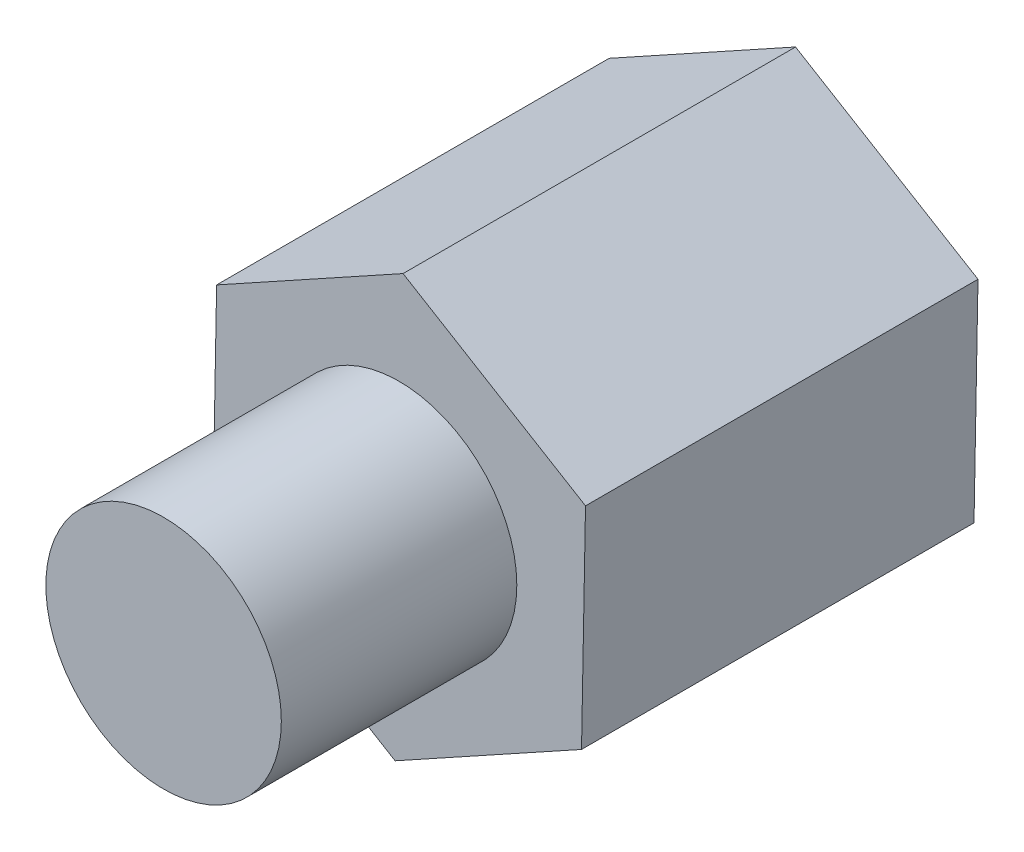
ISO-10303-21;
HEADER;
FILE_DESCRIPTION(('STEP AP214'),'2;1');
FILE_NAME('part.step','',(''),(''),'','','');
FILE_SCHEMA(('AUTOMOTIVE_DESIGN { 1 0 10303 214 1 1 1 1 }'));
ENDSEC;
DATA;
#1=APPLICATION_CONTEXT('core data for automotive mechanical design processes');
#2=APPLICATION_PROTOCOL_DEFINITION('international standard','automotive_design',2000,#1);
#3=PRODUCT_CONTEXT('',#1,'mechanical');
#4=PRODUCT('Part','Part','',(#3));
#5=PRODUCT_RELATED_PRODUCT_CATEGORY('part','',(#4));
#6=PRODUCT_DEFINITION_FORMATION('','',#4);
#7=PRODUCT_DEFINITION_CONTEXT('part definition',#1,'design');
#8=PRODUCT_DEFINITION('design','',#6,#7);
#9=PRODUCT_DEFINITION_SHAPE('','',#8);
#10=(LENGTH_UNIT() NAMED_UNIT(*) SI_UNIT(.MILLI.,.METRE.));
#11=(NAMED_UNIT(*) PLANE_ANGLE_UNIT() SI_UNIT($,.RADIAN.));
#12=(NAMED_UNIT(*) SI_UNIT($,.STERADIAN.) SOLID_ANGLE_UNIT());
#13=UNCERTAINTY_MEASURE_WITH_UNIT(LENGTH_MEASURE(1.E-05),#10,'distance_accuracy_value','');
#14=(GEOMETRIC_REPRESENTATION_CONTEXT(3) GLOBAL_UNCERTAINTY_ASSIGNED_CONTEXT((#13)) GLOBAL_UNIT_ASSIGNED_CONTEXT((#10,
#11,#12)) REPRESENTATION_CONTEXT('',''));
#15=CARTESIAN_POINT('',(0.,0.,0.));
#16=DIRECTION('',(0.,0.,1.));
#17=DIRECTION('',(1.,0.,0.));
#18=AXIS2_PLACEMENT_3D('',#15,#16,#17);
#19=CARTESIAN_POINT('',(0.0507511059576976,2.71307162798504,5.));
#20=DIRECTION('',(0.483715381528788,-0.875225359363209,0.));
#21=DIRECTION('',(0.875225359363209,0.483715381528788,0.));
#22=AXIS2_PLACEMENT_3D('',#19,#20,#21);
#23=PLANE('',#22);
#24=DIRECTION('',(-0.875225359363209,-0.483715381528788,0.));
#25=VECTOR('',#24,1.);
#26=CARTESIAN_POINT('',(0.0507511059576976,2.71307162798504,0.));
#27=LINE('',#26,#25);
#28=CARTESIAN_POINT('',(0.0507511059576976,2.71307162798504,0.));
#29=VERTEX_POINT('',#28);
#30=CARTESIAN_POINT('',(-2.324213399143,1.40048756102204,0.));
#31=VERTEX_POINT('',#30);
#32=EDGE_CURVE('E136',#29,#31,#27,.T.);
#33=ORIENTED_EDGE('',*,*,#32,.T.);
#34=DIRECTION('',(0.,0.,-1.));
#35=VECTOR('',#34,1.);
#36=CARTESIAN_POINT('',(-2.324213399143,1.40048756102204,5.));
#37=LINE('',#36,#35);
#38=CARTESIAN_POINT('',(-2.324213399143,1.40048756102204,5.));
#39=VERTEX_POINT('',#38);
#40=EDGE_CURVE('E48',#39,#31,#37,.T.);
#41=ORIENTED_EDGE('',*,*,#40,.F.);
#42=DIRECTION('',(-0.875225359363209,-0.483715381528788,0.));
#43=VECTOR('',#42,1.);
#44=CARTESIAN_POINT('',(0.0507511059576976,2.71307162798504,5.));
#45=LINE('',#44,#43);
#46=CARTESIAN_POINT('',(0.0507511059576976,2.71307162798504,5.));
#47=VERTEX_POINT('',#46);
#48=EDGE_CURVE('E153',#47,#39,#45,.T.);
#49=ORIENTED_EDGE('',*,*,#48,.F.);
#50=DIRECTION('',(0.,0.,-1.));
#51=VECTOR('',#50,1.);
#52=CARTESIAN_POINT('',(0.0507511059576976,2.71307162798504,5.));
#53=LINE('',#52,#51);
#54=EDGE_CURVE('E132',#47,#29,#53,.T.);
#55=ORIENTED_EDGE('',*,*,#54,.T.);
#56=EDGE_LOOP('',(#33,#41,#49,#55));
#57=FACE_BOUND('',#56,.T.);
#58=ADVANCED_FACE('F45',(#57),#23,.F.);
#59=CARTESIAN_POINT('',(-2.324213399143,1.40048756102204,5.));
#60=DIRECTION('',(0.999825086009298,-0.0187028710763916,0.));
#61=DIRECTION('',(0.0187028710763916,0.999825086009298,0.));
#62=AXIS2_PLACEMENT_3D('',#59,#60,#61);
#63=PLANE('',#62);
#64=DIRECTION('',(-0.0187028710763916,-0.999825086009298,0.));
#65=VECTOR('',#64,1.);
#66=CARTESIAN_POINT('',(-2.324213399143,1.40048756102204,0.));
#67=LINE('',#66,#65);
#68=CARTESIAN_POINT('',(-2.3749645051007,-1.312584066963,0.));
#69=VERTEX_POINT('',#68);
#70=EDGE_CURVE('E140',#31,#69,#67,.T.);
#71=ORIENTED_EDGE('',*,*,#70,.T.);
#72=DIRECTION('',(0.,0.,-1.));
#73=VECTOR('',#72,1.);
#74=CARTESIAN_POINT('',(-2.3749645051007,-1.312584066963,5.));
#75=LINE('',#74,#73);
#76=CARTESIAN_POINT('',(-2.3749645051007,-1.312584066963,5.));
#77=VERTEX_POINT('',#76);
#78=EDGE_CURVE('E159',#77,#69,#75,.T.);
#79=ORIENTED_EDGE('',*,*,#78,.F.);
#80=DIRECTION('',(-0.0187028710763916,-0.999825086009298,0.));
#81=VECTOR('',#80,1.);
#82=CARTESIAN_POINT('',(-2.324213399143,1.40048756102204,5.));
#83=LINE('',#82,#81);
#84=EDGE_CURVE('E101',#39,#77,#83,.T.);
#85=ORIENTED_EDGE('',*,*,#84,.F.);
#86=ORIENTED_EDGE('',*,*,#40,.T.);
#87=EDGE_LOOP('',(#71,#79,#85,#86));
#88=FACE_BOUND('',#87,.T.);
#89=ADVANCED_FACE('F166',(#88),#63,.F.);
#90=CARTESIAN_POINT('',(-2.3749645051007,-1.312584066963,5.));
#91=DIRECTION('',(0.51610970448051,0.856522488286817,0.));
#92=DIRECTION('',(-0.856522488286817,0.51610970448051,0.));
#93=AXIS2_PLACEMENT_3D('',#90,#91,#92);
#94=PLANE('',#93);
#95=DIRECTION('',(0.856522488286817,-0.51610970448051,0.));
#96=VECTOR('',#95,1.);
#97=CARTESIAN_POINT('',(-2.3749645051007,-1.312584066963,0.));
#98=LINE('',#97,#96);
#99=CARTESIAN_POINT('',(-0.0507511059576958,-2.71307162798504,0.));
#100=VERTEX_POINT('',#99);
#101=EDGE_CURVE('E144',#69,#100,#98,.T.);
#102=ORIENTED_EDGE('',*,*,#101,.T.);
#103=DIRECTION('',(0.,0.,-1.));
#104=VECTOR('',#103,1.);
#105=CARTESIAN_POINT('',(-0.0507511059576958,-2.71307162798504,5.));
#106=LINE('',#105,#104);
#107=CARTESIAN_POINT('',(-0.0507511059576958,-2.71307162798504,5.));
#108=VERTEX_POINT('',#107);
#109=EDGE_CURVE('E125',#108,#100,#106,.T.);
#110=ORIENTED_EDGE('',*,*,#109,.F.);
#111=DIRECTION('',(0.856522488286817,-0.51610970448051,0.));
#112=VECTOR('',#111,1.);
#113=CARTESIAN_POINT('',(-2.3749645051007,-1.312584066963,5.));
#114=LINE('',#113,#112);
#115=EDGE_CURVE('E114',#77,#108,#114,.T.);
#116=ORIENTED_EDGE('',*,*,#115,.F.);
#117=ORIENTED_EDGE('',*,*,#78,.T.);
#118=EDGE_LOOP('',(#102,#110,#116,#117));
#119=FACE_BOUND('',#118,.T.);
#120=ADVANCED_FACE('F172',(#119),#94,.F.);
#121=CARTESIAN_POINT('',(-0.0507511059576958,-2.71307162798504,5.));
#122=DIRECTION('',(-0.483715381528788,0.875225359363209,0.));
#123=DIRECTION('',(-0.87522535936321,-0.483715381528788,0.));
#124=AXIS2_PLACEMENT_3D('',#121,#122,#123);
#125=PLANE('',#124);
#126=DIRECTION('',(0.875225359363209,0.483715381528788,0.));
#127=VECTOR('',#126,1.);
#128=CARTESIAN_POINT('',(-0.0507511059576958,-2.71307162798504,0.));
#129=LINE('',#128,#127);
#130=CARTESIAN_POINT('',(2.324213399143,-1.40048756102204,0.));
#131=VERTEX_POINT('',#130);
#132=EDGE_CURVE('E123',#100,#131,#129,.T.);
#133=ORIENTED_EDGE('',*,*,#132,.T.);
#134=DIRECTION('',(0.,0.,-1.));
#135=VECTOR('',#134,1.);
#136=CARTESIAN_POINT('',(2.324213399143,-1.40048756102204,5.));
#137=LINE('',#136,#135);
#138=CARTESIAN_POINT('',(2.324213399143,-1.40048756102204,5.));
#139=VERTEX_POINT('',#138);
#140=EDGE_CURVE('E120',#139,#131,#137,.T.);
#141=ORIENTED_EDGE('',*,*,#140,.F.);
#142=DIRECTION('',(0.875225359363209,0.483715381528788,0.));
#143=VECTOR('',#142,1.);
#144=CARTESIAN_POINT('',(-0.0507511059576958,-2.71307162798504,5.));
#145=LINE('',#144,#143);
#146=EDGE_CURVE('E108',#108,#139,#145,.T.);
#147=ORIENTED_EDGE('',*,*,#146,.F.);
#148=ORIENTED_EDGE('',*,*,#109,.T.);
#149=EDGE_LOOP('',(#133,#141,#147,#148));
#150=FACE_BOUND('',#149,.T.);
#151=ADVANCED_FACE('F121',(#150),#125,.F.);
#152=CARTESIAN_POINT('',(2.324213399143,-1.40048756102204,5.));
#153=DIRECTION('',(-0.999825086009298,0.0187028710763917,0.));
#154=DIRECTION('',(-0.0187028710763917,-0.999825086009298,0.));
#155=AXIS2_PLACEMENT_3D('',#152,#153,#154);
#156=PLANE('',#155);
#157=DIRECTION('',(0.0187028710763917,0.999825086009298,0.));
#158=VECTOR('',#157,1.);
#159=CARTESIAN_POINT('',(2.324213399143,-1.40048756102204,0.));
#160=LINE('',#159,#158);
#161=CARTESIAN_POINT('',(2.3749645051007,1.312584066963,0.));
#162=VERTEX_POINT('',#161);
#163=EDGE_CURVE('E86',#131,#162,#160,.T.);
#164=ORIENTED_EDGE('',*,*,#163,.T.);
#165=DIRECTION('',(0.,0.,-1.));
#166=VECTOR('',#165,1.);
#167=CARTESIAN_POINT('',(2.3749645051007,1.312584066963,5.));
#168=LINE('',#167,#166);
#169=CARTESIAN_POINT('',(2.3749645051007,1.312584066963,5.));
#170=VERTEX_POINT('',#169);
#171=EDGE_CURVE('E126',#170,#162,#168,.T.);
#172=ORIENTED_EDGE('',*,*,#171,.F.);
#173=DIRECTION('',(0.0187028710763917,0.999825086009298,0.));
#174=VECTOR('',#173,1.);
#175=CARTESIAN_POINT('',(2.324213399143,-1.40048756102204,5.));
#176=LINE('',#175,#174);
#177=EDGE_CURVE('E112',#139,#170,#176,.T.);
#178=ORIENTED_EDGE('',*,*,#177,.F.);
#179=ORIENTED_EDGE('',*,*,#140,.T.);
#180=EDGE_LOOP('',(#164,#172,#178,#179));
#181=FACE_BOUND('',#180,.T.);
#182=ADVANCED_FACE('F128',(#181),#156,.F.);
#183=CARTESIAN_POINT('',(2.3749645051007,1.312584066963,5.));
#184=DIRECTION('',(-0.51610970448051,-0.856522488286817,0.));
#185=DIRECTION('',(0.856522488286817,-0.51610970448051,0.));
#186=AXIS2_PLACEMENT_3D('',#183,#184,#185);
#187=PLANE('',#186);
#188=DIRECTION('',(-0.856522488286817,0.51610970448051,0.));
#189=VECTOR('',#188,1.);
#190=CARTESIAN_POINT('',(2.3749645051007,1.312584066963,0.));
#191=LINE('',#190,#189);
#192=EDGE_CURVE('E92',#162,#29,#191,.T.);
#193=ORIENTED_EDGE('',*,*,#192,.T.);
#194=ORIENTED_EDGE('',*,*,#54,.F.);
#195=DIRECTION('',(-0.856522488286817,0.51610970448051,0.));
#196=VECTOR('',#195,1.);
#197=CARTESIAN_POINT('',(2.3749645051007,1.312584066963,5.));
#198=LINE('',#197,#196);
#199=EDGE_CURVE('E63',#170,#47,#198,.T.);
#200=ORIENTED_EDGE('',*,*,#199,.F.);
#201=ORIENTED_EDGE('',*,*,#171,.T.);
#202=EDGE_LOOP('',(#193,#194,#200,#201));
#203=FACE_BOUND('',#202,.T.);
#204=ADVANCED_FACE('F209',(#203),#187,.F.);
#205=CARTESIAN_POINT('',(0.,0.,5.));
#206=DIRECTION('',(0.,0.,1.));
#207=DIRECTION('',(1.,0.,0.));
#208=AXIS2_PLACEMENT_3D('',#205,#206,#207);
#209=PLANE('',#208);
#210=CARTESIAN_POINT('',(0.,0.,5.));
#211=DIRECTION('',(0.,0.,1.));
#212=DIRECTION('',(1.,0.,0.));
#213=AXIS2_PLACEMENT_3D('',#210,#211,#212);
#214=CIRCLE('',#213,1.5);
#215=CARTESIAN_POINT('',(1.5,0.,5.));
#216=VERTEX_POINT('',#215);
#217=EDGE_CURVE('E11',#216,#216,#214,.T.);
#218=ORIENTED_EDGE('',*,*,#217,.F.);
#219=EDGE_LOOP('',(#218));
#220=FACE_BOUND('',#219,.T.);
#221=ORIENTED_EDGE('',*,*,#48,.T.);
#222=ORIENTED_EDGE('',*,*,#84,.T.);
#223=ORIENTED_EDGE('',*,*,#115,.T.);
#224=ORIENTED_EDGE('',*,*,#146,.T.);
#225=ORIENTED_EDGE('',*,*,#177,.T.);
#226=ORIENTED_EDGE('',*,*,#199,.T.);
#227=EDGE_LOOP('',(#221,#222,#223,#224,#225,#226));
#228=FACE_BOUND('',#227,.T.);
#229=ADVANCED_FACE('F110',(#220,#228),#209,.T.);
#230=CARTESIAN_POINT('',(0.,0.,0.));
#231=DIRECTION('',(0.,0.,1.));
#232=DIRECTION('',(1.,0.,0.));
#233=AXIS2_PLACEMENT_3D('',#230,#231,#232);
#234=PLANE('',#233);
#235=CARTESIAN_POINT('',(0.,0.,0.));
#236=DIRECTION('',(0.,0.,-1.));
#237=DIRECTION('',(-1.,0.,0.));
#238=AXIS2_PLACEMENT_3D('',#235,#236,#237);
#239=CIRCLE('',#238,1.5);
#240=CARTESIAN_POINT('',(-1.5,0.,0.));
#241=VERTEX_POINT('',#240);
#242=EDGE_CURVE('E183',#241,#241,#239,.T.);
#243=ORIENTED_EDGE('',*,*,#242,.F.);
#244=EDGE_LOOP('',(#243));
#245=FACE_BOUND('',#244,.T.);
#246=ORIENTED_EDGE('',*,*,#32,.F.);
#247=ORIENTED_EDGE('',*,*,#192,.F.);
#248=ORIENTED_EDGE('',*,*,#163,.F.);
#249=ORIENTED_EDGE('',*,*,#132,.F.);
#250=ORIENTED_EDGE('',*,*,#101,.F.);
#251=ORIENTED_EDGE('',*,*,#70,.F.);
#252=EDGE_LOOP('',(#246,#247,#248,#249,#250,#251));
#253=FACE_BOUND('',#252,.T.);
#254=ADVANCED_FACE('F171',(#245,#253),#234,.F.);
#255=CARTESIAN_POINT('',(0.,0.,8.));
#256=DIRECTION('',(0.,0.,-1.));
#257=DIRECTION('',(-1.,0.,0.));
#258=AXIS2_PLACEMENT_3D('',#255,#256,#257);
#259=CYLINDRICAL_SURFACE('',#258,1.5);
#260=CARTESIAN_POINT('',(0.,0.,8.));
#261=DIRECTION('',(0.,0.,1.));
#262=DIRECTION('',(1.,0.,0.));
#263=AXIS2_PLACEMENT_3D('',#260,#261,#262);
#264=CIRCLE('',#263,1.5);
#265=CARTESIAN_POINT('',(1.5,0.,8.));
#266=VERTEX_POINT('',#265);
#267=EDGE_CURVE('E141',#266,#266,#264,.T.);
#268=ORIENTED_EDGE('',*,*,#267,.F.);
#269=EDGE_LOOP('',(#268));
#270=FACE_BOUND('',#269,.T.);
#271=ORIENTED_EDGE('',*,*,#217,.T.);
#272=EDGE_LOOP('',(#271));
#273=FACE_BOUND('',#272,.T.);
#274=ADVANCED_FACE('F201',(#270,#273),#259,.T.);
#275=CARTESIAN_POINT('',(0.,0.,8.));
#276=DIRECTION('',(0.,0.,1.));
#277=DIRECTION('',(1.,0.,0.));
#278=AXIS2_PLACEMENT_3D('',#275,#276,#277);
#279=PLANE('',#278);
#280=ORIENTED_EDGE('',*,*,#267,.T.);
#281=EDGE_LOOP('',(#280));
#282=FACE_BOUND('',#281,.T.);
#283=ADVANCED_FACE('F196',(#282),#279,.T.);
#284=CARTESIAN_POINT('',(0.,0.,3.));
#285=DIRECTION('',(0.,0.,-1.));
#286=DIRECTION('',(-1.,0.,0.));
#287=AXIS2_PLACEMENT_3D('',#284,#285,#286);
#288=CYLINDRICAL_SURFACE('',#287,1.5);
#289=CARTESIAN_POINT('',(0.,0.,3.));
#290=DIRECTION('',(0.,0.,-1.));
#291=DIRECTION('',(-1.,0.,0.));
#292=AXIS2_PLACEMENT_3D('',#289,#290,#291);
#293=CIRCLE('',#292,1.5);
#294=CARTESIAN_POINT('',(-1.5,0.,3.));
#295=VERTEX_POINT('',#294);
#296=EDGE_CURVE('E182',#295,#295,#293,.T.);
#297=ORIENTED_EDGE('',*,*,#296,.F.);
#298=EDGE_LOOP('',(#297));
#299=FACE_BOUND('',#298,.T.);
#300=ORIENTED_EDGE('',*,*,#242,.T.);
#301=EDGE_LOOP('',(#300));
#302=FACE_BOUND('',#301,.T.);
#303=ADVANCED_FACE('F193',(#299,#302),#288,.F.);
#304=CARTESIAN_POINT('',(0.,0.,3.));
#305=DIRECTION('',(0.,0.,-1.));
#306=DIRECTION('',(-1.,0.,0.));
#307=AXIS2_PLACEMENT_3D('',#304,#305,#306);
#308=PLANE('',#307);
#309=ORIENTED_EDGE('',*,*,#296,.T.);
#310=EDGE_LOOP('',(#309));
#311=FACE_BOUND('',#310,.T.);
#312=ADVANCED_FACE('F191',(#311),#308,.T.);
#313=CLOSED_SHELL('',(#58,#89,#120,#151,#182,#204,#229,#254,#274,#283,#303,#312));
#314=MANIFOLD_SOLID_BREP('B2',#313);
#315=ADVANCED_BREP_SHAPE_REPRESENTATION('',(#18,#314),#14);
#316=SHAPE_DEFINITION_REPRESENTATION(#9,#315);
ENDSEC;
END-ISO-10303-21;
